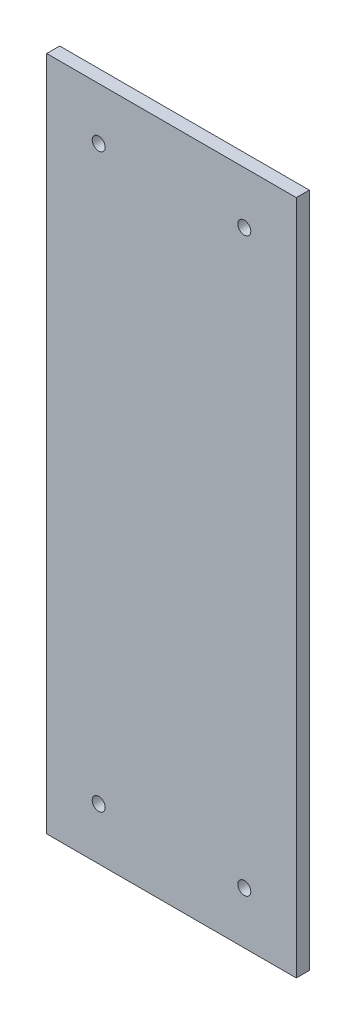
ISO-10303-21;
HEADER;
FILE_DESCRIPTION(('STEP AP214'),'2;1');
FILE_NAME('part.step','',(''),(''),'','','');
FILE_SCHEMA(('AUTOMOTIVE_DESIGN { 1 0 10303 214 1 1 1 1 }'));
ENDSEC;
DATA;
#1=APPLICATION_CONTEXT('core data for automotive mechanical design processes');
#2=APPLICATION_PROTOCOL_DEFINITION('international standard','automotive_design',2000,#1);
#3=PRODUCT_CONTEXT('',#1,'mechanical');
#4=PRODUCT('Part','Part','',(#3));
#5=PRODUCT_RELATED_PRODUCT_CATEGORY('part','',(#4));
#6=PRODUCT_DEFINITION_FORMATION('','',#4);
#7=PRODUCT_DEFINITION_CONTEXT('part definition',#1,'design');
#8=PRODUCT_DEFINITION('design','',#6,#7);
#9=PRODUCT_DEFINITION_SHAPE('','',#8);
#10=(LENGTH_UNIT() NAMED_UNIT(*) SI_UNIT(.MILLI.,.METRE.));
#11=(NAMED_UNIT(*) PLANE_ANGLE_UNIT() SI_UNIT($,.RADIAN.));
#12=(NAMED_UNIT(*) SI_UNIT($,.STERADIAN.) SOLID_ANGLE_UNIT());
#13=UNCERTAINTY_MEASURE_WITH_UNIT(LENGTH_MEASURE(1.E-05),#10,'distance_accuracy_value','');
#14=(GEOMETRIC_REPRESENTATION_CONTEXT(3) GLOBAL_UNCERTAINTY_ASSIGNED_CONTEXT((#13)) GLOBAL_UNIT_ASSIGNED_CONTEXT((#10,
#11,#12)) REPRESENTATION_CONTEXT('',''));
#15=CARTESIAN_POINT('',(0.,0.,0.));
#16=DIRECTION('',(0.,0.,1.));
#17=DIRECTION('',(1.,0.,0.));
#18=AXIS2_PLACEMENT_3D('',#15,#16,#17);
#19=CARTESIAN_POINT('',(96.52,25.4000000000001,0.));
#20=DIRECTION('',(0.,0.,1.));
#21=DIRECTION('',(1.,0.,0.));
#22=AXIS2_PLACEMENT_3D('',#19,#20,#21);
#23=CYLINDRICAL_SURFACE('',#22,3.175);
#24=CARTESIAN_POINT('',(96.52,25.4000000000001,0.));
#25=DIRECTION('',(0.,0.,1.));
#26=DIRECTION('',(1.,0.,0.));
#27=AXIS2_PLACEMENT_3D('',#24,#25,#26);
#28=CIRCLE('',#27,3.175);
#29=CARTESIAN_POINT('',(99.695,25.4000000000001,0.));
#30=VERTEX_POINT('',#29);
#31=EDGE_CURVE('E40',#30,#30,#28,.T.);
#32=ORIENTED_EDGE('',*,*,#31,.F.);
#33=EDGE_LOOP('',(#32));
#34=FACE_BOUND('',#33,.T.);
#35=CARTESIAN_POINT('',(96.52,25.4000000000001,6.35));
#36=DIRECTION('',(0.,0.,1.));
#37=DIRECTION('',(1.,0.,0.));
#38=AXIS2_PLACEMENT_3D('',#35,#36,#37);
#39=CIRCLE('',#38,3.175);
#40=CARTESIAN_POINT('',(99.695,25.4000000000001,6.35));
#41=VERTEX_POINT('',#40);
#42=EDGE_CURVE('E11',#41,#41,#39,.T.);
#43=ORIENTED_EDGE('',*,*,#42,.T.);
#44=EDGE_LOOP('',(#43));
#45=FACE_BOUND('',#44,.T.);
#46=ADVANCED_FACE('F32',(#34,#45),#23,.F.);
#47=CARTESIAN_POINT('',(25.4,25.4000000000001,0.));
#48=DIRECTION('',(0.,0.,1.));
#49=DIRECTION('',(1.,0.,0.));
#50=AXIS2_PLACEMENT_3D('',#47,#48,#49);
#51=CYLINDRICAL_SURFACE('',#50,3.175);
#52=CARTESIAN_POINT('',(25.4,25.4000000000001,0.));
#53=DIRECTION('',(0.,0.,1.));
#54=DIRECTION('',(1.,0.,0.));
#55=AXIS2_PLACEMENT_3D('',#52,#53,#54);
#56=CIRCLE('',#55,3.175);
#57=CARTESIAN_POINT('',(28.575,25.4000000000001,0.));
#58=VERTEX_POINT('',#57);
#59=EDGE_CURVE('E110',#58,#58,#56,.T.);
#60=ORIENTED_EDGE('',*,*,#59,.F.);
#61=EDGE_LOOP('',(#60));
#62=FACE_BOUND('',#61,.T.);
#63=CARTESIAN_POINT('',(25.4,25.4000000000001,6.35));
#64=DIRECTION('',(0.,0.,1.));
#65=DIRECTION('',(1.,0.,0.));
#66=AXIS2_PLACEMENT_3D('',#63,#64,#65);
#67=CIRCLE('',#66,3.175);
#68=CARTESIAN_POINT('',(28.575,25.4000000000001,6.35));
#69=VERTEX_POINT('',#68);
#70=EDGE_CURVE('E113',#69,#69,#67,.T.);
#71=ORIENTED_EDGE('',*,*,#70,.T.);
#72=EDGE_LOOP('',(#71));
#73=FACE_BOUND('',#72,.T.);
#74=ADVANCED_FACE('F122',(#62,#73),#51,.F.);
#75=CARTESIAN_POINT('',(0.,0.,6.35));
#76=DIRECTION('',(1.,0.,0.));
#77=DIRECTION('',(0.,0.,-1.));
#78=AXIS2_PLACEMENT_3D('',#75,#76,#77);
#79=PLANE('',#78);
#80=DIRECTION('',(0.,-1.,0.));
#81=VECTOR('',#80,1.);
#82=CARTESIAN_POINT('',(0.,0.,0.));
#83=LINE('',#82,#81);
#84=CARTESIAN_POINT('',(0.,330.2,0.));
#85=VERTEX_POINT('',#84);
#86=CARTESIAN_POINT('',(0.,0.,0.));
#87=VERTEX_POINT('',#86);
#88=EDGE_CURVE('E100',#85,#87,#83,.T.);
#89=ORIENTED_EDGE('',*,*,#88,.T.);
#90=DIRECTION('',(0.,0.,-1.));
#91=VECTOR('',#90,1.);
#92=CARTESIAN_POINT('',(0.,0.,6.35));
#93=LINE('',#92,#91);
#94=CARTESIAN_POINT('',(0.,0.,6.35));
#95=VERTEX_POINT('',#94);
#96=EDGE_CURVE('E91',#95,#87,#93,.T.);
#97=ORIENTED_EDGE('',*,*,#96,.F.);
#98=DIRECTION('',(0.,-1.,0.));
#99=VECTOR('',#98,1.);
#100=CARTESIAN_POINT('',(0.,0.,6.35));
#101=LINE('',#100,#99);
#102=CARTESIAN_POINT('',(0.,330.2,6.35));
#103=VERTEX_POINT('',#102);
#104=EDGE_CURVE('E85',#103,#95,#101,.T.);
#105=ORIENTED_EDGE('',*,*,#104,.F.);
#106=DIRECTION('',(0.,0.,-1.));
#107=VECTOR('',#106,1.);
#108=CARTESIAN_POINT('',(0.,330.2,6.35));
#109=LINE('',#108,#107);
#110=EDGE_CURVE('E96',#103,#85,#109,.T.);
#111=ORIENTED_EDGE('',*,*,#110,.T.);
#112=EDGE_LOOP('',(#89,#97,#105,#111));
#113=FACE_BOUND('',#112,.T.);
#114=ADVANCED_FACE('F146',(#113),#79,.F.);
#115=CARTESIAN_POINT('',(0.,0.,6.35));
#116=DIRECTION('',(0.,1.,0.));
#117=DIRECTION('',(0.,0.,1.));
#118=AXIS2_PLACEMENT_3D('',#115,#116,#117);
#119=PLANE('',#118);
#120=DIRECTION('',(1.,0.,0.));
#121=VECTOR('',#120,1.);
#122=CARTESIAN_POINT('',(0.,0.,0.));
#123=LINE('',#122,#121);
#124=CARTESIAN_POINT('',(121.92,0.,0.));
#125=VERTEX_POINT('',#124);
#126=EDGE_CURVE('E90',#87,#125,#123,.T.);
#127=ORIENTED_EDGE('',*,*,#126,.T.);
#128=DIRECTION('',(0.,0.,-1.));
#129=VECTOR('',#128,1.);
#130=CARTESIAN_POINT('',(121.92,0.,6.35));
#131=LINE('',#130,#129);
#132=CARTESIAN_POINT('',(121.92,0.,6.35));
#133=VERTEX_POINT('',#132);
#134=EDGE_CURVE('E88',#133,#125,#131,.T.);
#135=ORIENTED_EDGE('',*,*,#134,.F.);
#136=DIRECTION('',(1.,0.,0.));
#137=VECTOR('',#136,1.);
#138=CARTESIAN_POINT('',(0.,0.,6.35));
#139=LINE('',#138,#137);
#140=EDGE_CURVE('E79',#95,#133,#139,.T.);
#141=ORIENTED_EDGE('',*,*,#140,.F.);
#142=ORIENTED_EDGE('',*,*,#96,.T.);
#143=EDGE_LOOP('',(#127,#135,#141,#142));
#144=FACE_BOUND('',#143,.T.);
#145=ADVANCED_FACE('F89',(#144),#119,.F.);
#146=CARTESIAN_POINT('',(121.92,0.,6.35));
#147=DIRECTION('',(-1.,0.,0.));
#148=DIRECTION('',(0.,0.,1.));
#149=AXIS2_PLACEMENT_3D('',#146,#147,#148);
#150=PLANE('',#149);
#151=DIRECTION('',(0.,1.,0.));
#152=VECTOR('',#151,1.);
#153=CARTESIAN_POINT('',(121.92,0.,0.));
#154=LINE('',#153,#152);
#155=CARTESIAN_POINT('',(121.92,330.2,0.));
#156=VERTEX_POINT('',#155);
#157=EDGE_CURVE('E65',#125,#156,#154,.T.);
#158=ORIENTED_EDGE('',*,*,#157,.T.);
#159=DIRECTION('',(0.,0.,-1.));
#160=VECTOR('',#159,1.);
#161=CARTESIAN_POINT('',(121.92,330.2,6.35));
#162=LINE('',#161,#160);
#163=CARTESIAN_POINT('',(121.92,330.2,6.35));
#164=VERTEX_POINT('',#163);
#165=EDGE_CURVE('E92',#164,#156,#162,.T.);
#166=ORIENTED_EDGE('',*,*,#165,.F.);
#167=DIRECTION('',(0.,1.,0.));
#168=VECTOR('',#167,1.);
#169=CARTESIAN_POINT('',(121.92,0.,6.35));
#170=LINE('',#169,#168);
#171=EDGE_CURVE('E83',#133,#164,#170,.T.);
#172=ORIENTED_EDGE('',*,*,#171,.F.);
#173=ORIENTED_EDGE('',*,*,#134,.T.);
#174=EDGE_LOOP('',(#158,#166,#172,#173));
#175=FACE_BOUND('',#174,.T.);
#176=ADVANCED_FACE('F94',(#175),#150,.F.);
#177=CARTESIAN_POINT('',(0.,330.2,6.35));
#178=DIRECTION('',(0.,-1.,0.));
#179=DIRECTION('',(0.,0.,-1.));
#180=AXIS2_PLACEMENT_3D('',#177,#178,#179);
#181=PLANE('',#180);
#182=DIRECTION('',(-1.,0.,0.));
#183=VECTOR('',#182,1.);
#184=CARTESIAN_POINT('',(0.,330.2,0.));
#185=LINE('',#184,#183);
#186=EDGE_CURVE('E71',#156,#85,#185,.T.);
#187=ORIENTED_EDGE('',*,*,#186,.T.);
#188=ORIENTED_EDGE('',*,*,#110,.F.);
#189=DIRECTION('',(-1.,0.,0.));
#190=VECTOR('',#189,1.);
#191=CARTESIAN_POINT('',(0.,330.2,6.35));
#192=LINE('',#191,#190);
#193=EDGE_CURVE('E48',#164,#103,#192,.T.);
#194=ORIENTED_EDGE('',*,*,#193,.F.);
#195=ORIENTED_EDGE('',*,*,#165,.T.);
#196=EDGE_LOOP('',(#187,#188,#194,#195));
#197=FACE_BOUND('',#196,.T.);
#198=ADVANCED_FACE('F126',(#197),#181,.F.);
#199=CARTESIAN_POINT('',(0.,0.,6.35));
#200=DIRECTION('',(0.,0.,-1.));
#201=DIRECTION('',(-1.,0.,0.));
#202=AXIS2_PLACEMENT_3D('',#199,#200,#201);
#203=PLANE('',#202);
#204=CARTESIAN_POINT('',(96.52,304.8,6.35));
#205=DIRECTION('',(0.,0.,1.));
#206=DIRECTION('',(1.,0.,0.));
#207=AXIS2_PLACEMENT_3D('',#204,#205,#206);
#208=CIRCLE('',#207,3.175);
#209=CARTESIAN_POINT('',(99.695,304.8,6.35));
#210=VERTEX_POINT('',#209);
#211=EDGE_CURVE('E217',#210,#210,#208,.T.);
#212=ORIENTED_EDGE('',*,*,#211,.F.);
#213=EDGE_LOOP('',(#212));
#214=FACE_BOUND('',#213,.T.);
#215=CARTESIAN_POINT('',(25.4,304.8,6.35));
#216=DIRECTION('',(0.,0.,1.));
#217=DIRECTION('',(1.,0.,0.));
#218=AXIS2_PLACEMENT_3D('',#215,#216,#217);
#219=CIRCLE('',#218,3.175);
#220=CARTESIAN_POINT('',(28.575,304.8,6.35));
#221=VERTEX_POINT('',#220);
#222=EDGE_CURVE('E218',#221,#221,#219,.T.);
#223=ORIENTED_EDGE('',*,*,#222,.F.);
#224=EDGE_LOOP('',(#223));
#225=FACE_BOUND('',#224,.T.);
#226=ORIENTED_EDGE('',*,*,#104,.T.);
#227=ORIENTED_EDGE('',*,*,#140,.T.);
#228=ORIENTED_EDGE('',*,*,#171,.T.);
#229=ORIENTED_EDGE('',*,*,#193,.T.);
#230=EDGE_LOOP('',(#226,#227,#228,#229));
#231=FACE_BOUND('',#230,.T.);
#232=ORIENTED_EDGE('',*,*,#70,.F.);
#233=EDGE_LOOP('',(#232));
#234=FACE_BOUND('',#233,.T.);
#235=ORIENTED_EDGE('',*,*,#42,.F.);
#236=EDGE_LOOP('',(#235));
#237=FACE_BOUND('',#236,.T.);
#238=ADVANCED_FACE('F80',(#214,#225,#231,#234,#237),#203,.F.);
#239=CARTESIAN_POINT('',(0.,0.,0.));
#240=DIRECTION('',(0.,0.,-1.));
#241=DIRECTION('',(-1.,0.,0.));
#242=AXIS2_PLACEMENT_3D('',#239,#240,#241);
#243=PLANE('',#242);
#244=CARTESIAN_POINT('',(96.52,304.8,0.));
#245=DIRECTION('',(0.,0.,1.));
#246=DIRECTION('',(1.,0.,0.));
#247=AXIS2_PLACEMENT_3D('',#244,#245,#246);
#248=CIRCLE('',#247,3.175);
#249=CARTESIAN_POINT('',(99.695,304.8,0.));
#250=VERTEX_POINT('',#249);
#251=EDGE_CURVE('E215',#250,#250,#248,.T.);
#252=ORIENTED_EDGE('',*,*,#251,.T.);
#253=EDGE_LOOP('',(#252));
#254=FACE_BOUND('',#253,.T.);
#255=CARTESIAN_POINT('',(25.4,304.8,0.));
#256=DIRECTION('',(0.,0.,1.));
#257=DIRECTION('',(1.,0.,0.));
#258=AXIS2_PLACEMENT_3D('',#255,#256,#257);
#259=CIRCLE('',#258,3.175);
#260=CARTESIAN_POINT('',(28.575,304.8,0.));
#261=VERTEX_POINT('',#260);
#262=EDGE_CURVE('E103',#261,#261,#259,.T.);
#263=ORIENTED_EDGE('',*,*,#262,.T.);
#264=EDGE_LOOP('',(#263));
#265=FACE_BOUND('',#264,.T.);
#266=ORIENTED_EDGE('',*,*,#88,.F.);
#267=ORIENTED_EDGE('',*,*,#186,.F.);
#268=ORIENTED_EDGE('',*,*,#157,.F.);
#269=ORIENTED_EDGE('',*,*,#126,.F.);
#270=EDGE_LOOP('',(#266,#267,#268,#269));
#271=FACE_BOUND('',#270,.T.);
#272=ORIENTED_EDGE('',*,*,#59,.T.);
#273=EDGE_LOOP('',(#272));
#274=FACE_BOUND('',#273,.T.);
#275=ORIENTED_EDGE('',*,*,#31,.T.);
#276=EDGE_LOOP('',(#275));
#277=FACE_BOUND('',#276,.T.);
#278=ADVANCED_FACE('F118',(#254,#265,#271,#274,#277),#243,.T.);
#279=CARTESIAN_POINT('',(25.4,304.8,0.));
#280=DIRECTION('',(0.,0.,1.));
#281=DIRECTION('',(1.,0.,0.));
#282=AXIS2_PLACEMENT_3D('',#279,#280,#281);
#283=CYLINDRICAL_SURFACE('',#282,3.175);
#284=ORIENTED_EDGE('',*,*,#262,.F.);
#285=EDGE_LOOP('',(#284));
#286=FACE_BOUND('',#285,.T.);
#287=ORIENTED_EDGE('',*,*,#222,.T.);
#288=EDGE_LOOP('',(#287));
#289=FACE_BOUND('',#288,.T.);
#290=ADVANCED_FACE('F133',(#286,#289),#283,.F.);
#291=CARTESIAN_POINT('',(96.52,304.8,0.));
#292=DIRECTION('',(0.,0.,1.));
#293=DIRECTION('',(1.,0.,0.));
#294=AXIS2_PLACEMENT_3D('',#291,#292,#293);
#295=CYLINDRICAL_SURFACE('',#294,3.175);
#296=ORIENTED_EDGE('',*,*,#251,.F.);
#297=EDGE_LOOP('',(#296));
#298=FACE_BOUND('',#297,.T.);
#299=ORIENTED_EDGE('',*,*,#211,.T.);
#300=EDGE_LOOP('',(#299));
#301=FACE_BOUND('',#300,.T.);
#302=ADVANCED_FACE('F184',(#298,#301),#295,.F.);
#303=CLOSED_SHELL('',(#46,#74,#114,#145,#176,#198,#238,#278,#290,#302));
#304=MANIFOLD_SOLID_BREP('B2',#303);
#305=ADVANCED_BREP_SHAPE_REPRESENTATION('',(#18,#304),#14);
#306=SHAPE_DEFINITION_REPRESENTATION(#9,#305);
ENDSEC;
END-ISO-10303-21;
